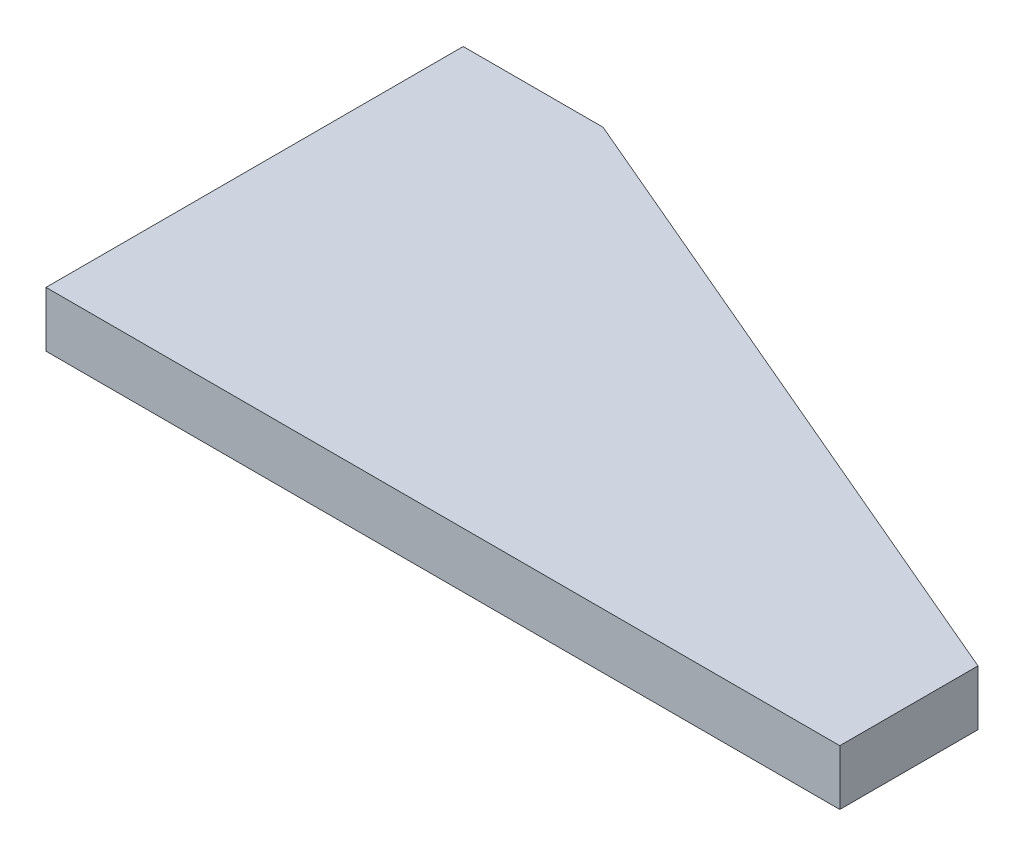
ISO-10303-21;
HEADER;
FILE_DESCRIPTION(('STEP AP214'),'2;1');
FILE_NAME('part.step','',(''),(''),'','','');
FILE_SCHEMA(('AUTOMOTIVE_DESIGN { 1 0 10303 214 1 1 1 1 }'));
ENDSEC;
DATA;
#1=APPLICATION_CONTEXT('core data for automotive mechanical design processes');
#2=APPLICATION_PROTOCOL_DEFINITION('international standard','automotive_design',2000,#1);
#3=PRODUCT_CONTEXT('',#1,'mechanical');
#4=PRODUCT('Part','Part','',(#3));
#5=PRODUCT_RELATED_PRODUCT_CATEGORY('part','',(#4));
#6=PRODUCT_DEFINITION_FORMATION('','',#4);
#7=PRODUCT_DEFINITION_CONTEXT('part definition',#1,'design');
#8=PRODUCT_DEFINITION('design','',#6,#7);
#9=PRODUCT_DEFINITION_SHAPE('','',#8);
#10=(LENGTH_UNIT() NAMED_UNIT(*) SI_UNIT(.MILLI.,.METRE.));
#11=(NAMED_UNIT(*) PLANE_ANGLE_UNIT() SI_UNIT($,.RADIAN.));
#12=(NAMED_UNIT(*) SI_UNIT($,.STERADIAN.) SOLID_ANGLE_UNIT());
#13=UNCERTAINTY_MEASURE_WITH_UNIT(LENGTH_MEASURE(1.E-05),#10,'distance_accuracy_value','');
#14=(GEOMETRIC_REPRESENTATION_CONTEXT(3) GLOBAL_UNCERTAINTY_ASSIGNED_CONTEXT((#13)) GLOBAL_UNIT_ASSIGNED_CONTEXT((#10,
#11,#12)) REPRESENTATION_CONTEXT('',''));
#15=CARTESIAN_POINT('',(0.,0.,0.));
#16=DIRECTION('',(0.,0.,1.));
#17=DIRECTION('',(1.,0.,0.));
#18=AXIS2_PLACEMENT_3D('',#15,#16,#17);
#19=CARTESIAN_POINT('',(0.,4.,0.));
#20=DIRECTION('',(1.,0.,0.));
#21=DIRECTION('',(0.,0.,-1.));
#22=AXIS2_PLACEMENT_3D('',#19,#20,#21);
#23=PLANE('',#22);
#24=DIRECTION('',(0.,0.,1.));
#25=VECTOR('',#24,1.);
#26=CARTESIAN_POINT('',(0.,0.,0.));
#27=LINE('',#26,#25);
#28=CARTESIAN_POINT('',(0.,0.,-30.1869761080617));
#29=VERTEX_POINT('',#28);
#30=CARTESIAN_POINT('',(0.,0.,0.));
#31=VERTEX_POINT('',#30);
#32=EDGE_CURVE('E105',#29,#31,#27,.T.);
#33=ORIENTED_EDGE('',*,*,#32,.T.);
#34=DIRECTION('',(0.,-1.,0.));
#35=VECTOR('',#34,1.);
#36=CARTESIAN_POINT('',(0.,4.,0.));
#37=LINE('',#36,#35);
#38=CARTESIAN_POINT('',(0.,4.,0.));
#39=VERTEX_POINT('',#38);
#40=EDGE_CURVE('E11',#39,#31,#37,.T.);
#41=ORIENTED_EDGE('',*,*,#40,.F.);
#42=DIRECTION('',(0.,0.,1.));
#43=VECTOR('',#42,1.);
#44=CARTESIAN_POINT('',(0.,4.,0.));
#45=LINE('',#44,#43);
#46=CARTESIAN_POINT('',(0.,4.,-30.1869761080617));
#47=VERTEX_POINT('',#46);
#48=EDGE_CURVE('E113',#47,#39,#45,.T.);
#49=ORIENTED_EDGE('',*,*,#48,.F.);
#50=DIRECTION('',(0.,-1.,0.));
#51=VECTOR('',#50,1.);
#52=CARTESIAN_POINT('',(0.,4.,-30.1869761080617));
#53=LINE('',#52,#51);
#54=EDGE_CURVE('E101',#47,#29,#53,.T.);
#55=ORIENTED_EDGE('',*,*,#54,.T.);
#56=EDGE_LOOP('',(#33,#41,#49,#55));
#57=FACE_BOUND('',#56,.T.);
#58=ADVANCED_FACE('F31',(#57),#23,.F.);
#59=CARTESIAN_POINT('',(0.,4.,0.));
#60=DIRECTION('',(0.,0.,-1.));
#61=DIRECTION('',(-1.,0.,0.));
#62=AXIS2_PLACEMENT_3D('',#59,#60,#61);
#63=PLANE('',#62);
#64=DIRECTION('',(1.,0.,0.));
#65=VECTOR('',#64,1.);
#66=CARTESIAN_POINT('',(0.,0.,0.));
#67=LINE('',#66,#65);
#68=CARTESIAN_POINT('',(57.4341276142133,0.,0.));
#69=VERTEX_POINT('',#68);
#70=EDGE_CURVE('E108',#31,#69,#67,.T.);
#71=ORIENTED_EDGE('',*,*,#70,.T.);
#72=DIRECTION('',(0.,-1.,0.));
#73=VECTOR('',#72,1.);
#74=CARTESIAN_POINT('',(57.4341276142133,4.,0.));
#75=LINE('',#74,#73);
#76=CARTESIAN_POINT('',(57.4341276142133,4.,0.));
#77=VERTEX_POINT('',#76);
#78=EDGE_CURVE('E39',#77,#69,#75,.T.);
#79=ORIENTED_EDGE('',*,*,#78,.F.);
#80=DIRECTION('',(1.,0.,0.));
#81=VECTOR('',#80,1.);
#82=CARTESIAN_POINT('',(0.,4.,0.));
#83=LINE('',#82,#81);
#84=EDGE_CURVE('E81',#39,#77,#83,.T.);
#85=ORIENTED_EDGE('',*,*,#84,.F.);
#86=ORIENTED_EDGE('',*,*,#40,.T.);
#87=EDGE_LOOP('',(#71,#79,#85,#86));
#88=FACE_BOUND('',#87,.T.);
#89=ADVANCED_FACE('F132',(#88),#63,.F.);
#90=CARTESIAN_POINT('',(57.4341276142133,4.,0.));
#91=DIRECTION('',(-1.,0.,0.));
#92=DIRECTION('',(0.,0.,1.));
#93=AXIS2_PLACEMENT_3D('',#90,#91,#92);
#94=PLANE('',#93);
#95=DIRECTION('',(0.,0.,-1.));
#96=VECTOR('',#95,1.);
#97=CARTESIAN_POINT('',(57.4341276142133,0.,0.));
#98=LINE('',#97,#96);
#99=CARTESIAN_POINT('',(57.4341276142133,0.,-9.99999997411227));
#100=VERTEX_POINT('',#99);
#101=EDGE_CURVE('E96',#69,#100,#98,.T.);
#102=ORIENTED_EDGE('',*,*,#101,.T.);
#103=DIRECTION('',(0.,-1.,0.));
#104=VECTOR('',#103,1.);
#105=CARTESIAN_POINT('',(57.4341276142133,4.,-9.99999997411227));
#106=LINE('',#105,#104);
#107=CARTESIAN_POINT('',(57.4341276142133,4.,-9.99999997411227));
#108=VERTEX_POINT('',#107);
#109=EDGE_CURVE('E93',#108,#100,#106,.T.);
#110=ORIENTED_EDGE('',*,*,#109,.F.);
#111=DIRECTION('',(0.,0.,-1.));
#112=VECTOR('',#111,1.);
#113=CARTESIAN_POINT('',(57.4341276142133,4.,0.));
#114=LINE('',#113,#112);
#115=EDGE_CURVE('E85',#77,#108,#114,.T.);
#116=ORIENTED_EDGE('',*,*,#115,.F.);
#117=ORIENTED_EDGE('',*,*,#78,.T.);
#118=EDGE_LOOP('',(#102,#110,#116,#117));
#119=FACE_BOUND('',#118,.T.);
#120=ADVANCED_FACE('F94',(#119),#94,.F.);
#121=CARTESIAN_POINT('',(10.1211021095278,4.,-30.1869761080617));
#122=DIRECTION('',(-0.392440087126734,0.,0.919777569859127));
#123=DIRECTION('',(0.919777569859127,0.,0.392440087126734));
#124=AXIS2_PLACEMENT_3D('',#121,#122,#123);
#125=PLANE('',#124);
#126=DIRECTION('',(-0.919777569859127,0.,-0.392440087126734));
#127=VECTOR('',#126,1.);
#128=CARTESIAN_POINT('',(10.1211021095278,0.,-30.1869761080617));
#129=LINE('',#128,#127);
#130=CARTESIAN_POINT('',(10.1211021095278,0.,-30.1869761080617));
#131=VERTEX_POINT('',#130);
#132=EDGE_CURVE('E67',#100,#131,#129,.T.);
#133=ORIENTED_EDGE('',*,*,#132,.T.);
#134=DIRECTION('',(0.,-1.,0.));
#135=VECTOR('',#134,1.);
#136=CARTESIAN_POINT('',(10.1211021095278,4.,-30.1869761080617));
#137=LINE('',#136,#135);
#138=CARTESIAN_POINT('',(10.1211021095278,4.,-30.1869761080617));
#139=VERTEX_POINT('',#138);
#140=EDGE_CURVE('E97',#139,#131,#137,.T.);
#141=ORIENTED_EDGE('',*,*,#140,.F.);
#142=DIRECTION('',(-0.919777569859127,0.,-0.392440087126734));
#143=VECTOR('',#142,1.);
#144=CARTESIAN_POINT('',(10.1211021095278,4.,-30.1869761080617));
#145=LINE('',#144,#143);
#146=EDGE_CURVE('E89',#108,#139,#145,.T.);
#147=ORIENTED_EDGE('',*,*,#146,.F.);
#148=ORIENTED_EDGE('',*,*,#109,.T.);
#149=EDGE_LOOP('',(#133,#141,#147,#148));
#150=FACE_BOUND('',#149,.T.);
#151=ADVANCED_FACE('F99',(#150),#125,.F.);
#152=CARTESIAN_POINT('',(0.,4.,-30.1869761080617));
#153=DIRECTION('',(0.,0.,1.));
#154=DIRECTION('',(1.,0.,0.));
#155=AXIS2_PLACEMENT_3D('',#152,#153,#154);
#156=PLANE('',#155);
#157=DIRECTION('',(-1.,0.,0.));
#158=VECTOR('',#157,1.);
#159=CARTESIAN_POINT('',(0.,0.,-30.1869761080617));
#160=LINE('',#159,#158);
#161=EDGE_CURVE('E73',#131,#29,#160,.T.);
#162=ORIENTED_EDGE('',*,*,#161,.T.);
#163=ORIENTED_EDGE('',*,*,#54,.F.);
#164=DIRECTION('',(-1.,0.,0.));
#165=VECTOR('',#164,1.);
#166=CARTESIAN_POINT('',(0.,4.,-30.1869761080617));
#167=LINE('',#166,#165);
#168=EDGE_CURVE('E47',#139,#47,#167,.T.);
#169=ORIENTED_EDGE('',*,*,#168,.F.);
#170=ORIENTED_EDGE('',*,*,#140,.T.);
#171=EDGE_LOOP('',(#162,#163,#169,#170));
#172=FACE_BOUND('',#171,.T.);
#173=ADVANCED_FACE('F121',(#172),#156,.F.);
#174=CARTESIAN_POINT('',(0.,4.,-30.1869761080617));
#175=DIRECTION('',(0.,-1.,0.));
#176=DIRECTION('',(0.,0.,-1.));
#177=AXIS2_PLACEMENT_3D('',#174,#175,#176);
#178=PLANE('',#177);
#179=ORIENTED_EDGE('',*,*,#48,.T.);
#180=ORIENTED_EDGE('',*,*,#84,.T.);
#181=ORIENTED_EDGE('',*,*,#115,.T.);
#182=ORIENTED_EDGE('',*,*,#146,.T.);
#183=ORIENTED_EDGE('',*,*,#168,.T.);
#184=EDGE_LOOP('',(#179,#180,#181,#182,#183));
#185=FACE_BOUND('',#184,.T.);
#186=ADVANCED_FACE('F87',(#185),#178,.F.);
#187=CARTESIAN_POINT('',(0.,0.,-30.1869761080617));
#188=DIRECTION('',(0.,-1.,0.));
#189=DIRECTION('',(0.,0.,-1.));
#190=AXIS2_PLACEMENT_3D('',#187,#188,#189);
#191=PLANE('',#190);
#192=ORIENTED_EDGE('',*,*,#32,.F.);
#193=ORIENTED_EDGE('',*,*,#161,.F.);
#194=ORIENTED_EDGE('',*,*,#132,.F.);
#195=ORIENTED_EDGE('',*,*,#101,.F.);
#196=ORIENTED_EDGE('',*,*,#70,.F.);
#197=EDGE_LOOP('',(#192,#193,#194,#195,#196));
#198=FACE_BOUND('',#197,.T.);
#199=ADVANCED_FACE('F117',(#198),#191,.T.);
#200=CLOSED_SHELL('',(#58,#89,#120,#151,#173,#186,#199));
#201=MANIFOLD_SOLID_BREP('B2',#200);
#202=ADVANCED_BREP_SHAPE_REPRESENTATION('',(#18,#201),#14);
#203=SHAPE_DEFINITION_REPRESENTATION(#9,#202);
ENDSEC;
END-ISO-10303-21;
